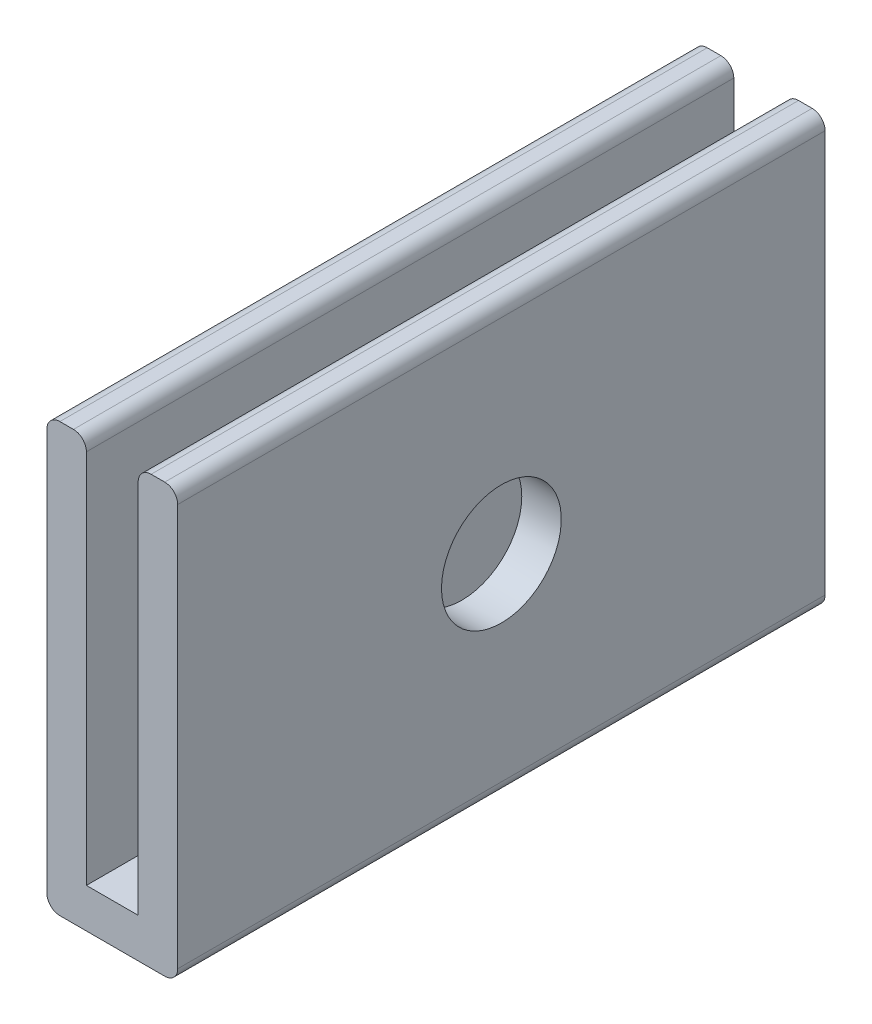
ISO-10303-21;
HEADER;
FILE_DESCRIPTION(('STEP AP214'),'2;1');
FILE_NAME('part.step','',(''),(''),'','','');
FILE_SCHEMA(('AUTOMOTIVE_DESIGN { 1 0 10303 214 1 1 1 1 }'));
ENDSEC;
DATA;
#1=APPLICATION_CONTEXT('core data for automotive mechanical design processes');
#2=APPLICATION_PROTOCOL_DEFINITION('international standard','automotive_design',2000,#1);
#3=PRODUCT_CONTEXT('',#1,'mechanical');
#4=PRODUCT('Part','Part','',(#3));
#5=PRODUCT_RELATED_PRODUCT_CATEGORY('part','',(#4));
#6=PRODUCT_DEFINITION_FORMATION('','',#4);
#7=PRODUCT_DEFINITION_CONTEXT('part definition',#1,'design');
#8=PRODUCT_DEFINITION('design','',#6,#7);
#9=PRODUCT_DEFINITION_SHAPE('','',#8);
#10=(LENGTH_UNIT() NAMED_UNIT(*) SI_UNIT(.MILLI.,.METRE.));
#11=(NAMED_UNIT(*) PLANE_ANGLE_UNIT() SI_UNIT($,.RADIAN.));
#12=(NAMED_UNIT(*) SI_UNIT($,.STERADIAN.) SOLID_ANGLE_UNIT());
#13=UNCERTAINTY_MEASURE_WITH_UNIT(LENGTH_MEASURE(1.E-05),#10,'distance_accuracy_value','');
#14=(GEOMETRIC_REPRESENTATION_CONTEXT(3) GLOBAL_UNCERTAINTY_ASSIGNED_CONTEXT((#13)) GLOBAL_UNIT_ASSIGNED_CONTEXT((#10,
#11,#12)) REPRESENTATION_CONTEXT('',''));
#15=CARTESIAN_POINT('',(0.,0.,0.));
#16=DIRECTION('',(0.,0.,1.));
#17=DIRECTION('',(1.,0.,0.));
#18=AXIS2_PLACEMENT_3D('',#15,#16,#17);
#19=CARTESIAN_POINT('',(3.64,12.82,20.));
#20=DIRECTION('',(0.,0.,-1.));
#21=DIRECTION('',(-1.,0.,0.));
#22=AXIS2_PLACEMENT_3D('',#19,#20,#21);
#23=CYLINDRICAL_SURFACE('',#22,0.400000000000001);
#24=CARTESIAN_POINT('',(3.64,12.82,0.));
#25=DIRECTION('',(0.,0.,1.));
#26=DIRECTION('',(-1.,0.,0.));
#27=AXIS2_PLACEMENT_3D('',#24,#25,#26);
#28=CIRCLE('',#27,0.400000000000001);
#29=CARTESIAN_POINT('',(4.04,12.82,0.));
#30=VERTEX_POINT('',#29);
#31=CARTESIAN_POINT('',(3.64,13.22,0.));
#32=VERTEX_POINT('',#31);
#33=EDGE_CURVE('E176',#30,#32,#28,.T.);
#34=ORIENTED_EDGE('',*,*,#33,.T.);
#35=DIRECTION('',(0.,0.,-1.));
#36=VECTOR('',#35,1.);
#37=CARTESIAN_POINT('',(3.64,13.22,20.));
#38=LINE('',#37,#36);
#39=CARTESIAN_POINT('',(3.64,13.22,20.));
#40=VERTEX_POINT('',#39);
#41=EDGE_CURVE('E11',#40,#32,#38,.T.);
#42=ORIENTED_EDGE('',*,*,#41,.F.);
#43=CARTESIAN_POINT('',(3.64,12.82,20.));
#44=DIRECTION('',(0.,0.,1.));
#45=DIRECTION('',(-1.,0.,0.));
#46=AXIS2_PLACEMENT_3D('',#43,#44,#45);
#47=CIRCLE('',#46,0.400000000000001);
#48=CARTESIAN_POINT('',(4.04,12.82,20.));
#49=VERTEX_POINT('',#48);
#50=EDGE_CURVE('E217',#49,#40,#47,.T.);
#51=ORIENTED_EDGE('',*,*,#50,.F.);
#52=DIRECTION('',(0.,0.,-1.));
#53=VECTOR('',#52,1.);
#54=CARTESIAN_POINT('',(4.04,12.82,20.));
#55=LINE('',#54,#53);
#56=EDGE_CURVE('E172',#49,#30,#55,.T.);
#57=ORIENTED_EDGE('',*,*,#56,.T.);
#58=EDGE_LOOP('',(#34,#42,#51,#57));
#59=FACE_BOUND('',#58,.T.);
#60=ADVANCED_FACE('F39',(#59),#23,.T.);
#61=CARTESIAN_POINT('',(3.22,13.22,20.));
#62=DIRECTION('',(0.,-1.,0.));
#63=DIRECTION('',(0.,0.,-1.));
#64=AXIS2_PLACEMENT_3D('',#61,#62,#63);
#65=PLANE('',#64);
#66=DIRECTION('',(-1.,0.,0.));
#67=VECTOR('',#66,1.);
#68=CARTESIAN_POINT('',(3.22,13.22,0.));
#69=LINE('',#68,#67);
#70=CARTESIAN_POINT('',(3.22,13.22,0.));
#71=VERTEX_POINT('',#70);
#72=EDGE_CURVE('E180',#32,#71,#69,.T.);
#73=ORIENTED_EDGE('',*,*,#72,.T.);
#74=DIRECTION('',(0.,0.,-1.));
#75=VECTOR('',#74,1.);
#76=CARTESIAN_POINT('',(3.22,13.22,20.));
#77=LINE('',#76,#75);
#78=CARTESIAN_POINT('',(3.22,13.22,20.));
#79=VERTEX_POINT('',#78);
#80=EDGE_CURVE('E48',#79,#71,#77,.T.);
#81=ORIENTED_EDGE('',*,*,#80,.F.);
#82=DIRECTION('',(-1.,0.,0.));
#83=VECTOR('',#82,1.);
#84=CARTESIAN_POINT('',(3.22,13.22,20.));
#85=LINE('',#84,#83);
#86=EDGE_CURVE('E117',#40,#79,#85,.T.);
#87=ORIENTED_EDGE('',*,*,#86,.F.);
#88=ORIENTED_EDGE('',*,*,#41,.T.);
#89=EDGE_LOOP('',(#73,#81,#87,#88));
#90=FACE_BOUND('',#89,.T.);
#91=ADVANCED_FACE('F327',(#90),#65,.F.);
#92=CARTESIAN_POINT('',(3.22,12.82,20.));
#93=DIRECTION('',(0.,0.,-1.));
#94=DIRECTION('',(-1.,0.,0.));
#95=AXIS2_PLACEMENT_3D('',#92,#93,#94);
#96=CYLINDRICAL_SURFACE('',#95,0.399999999999999);
#97=CARTESIAN_POINT('',(3.22,12.82,0.));
#98=DIRECTION('',(0.,0.,1.));
#99=DIRECTION('',(1.,0.,0.));
#100=AXIS2_PLACEMENT_3D('',#97,#98,#99);
#101=CIRCLE('',#100,0.399999999999999);
#102=CARTESIAN_POINT('',(2.82,12.82,0.));
#103=VERTEX_POINT('',#102);
#104=EDGE_CURVE('E184',#71,#103,#101,.T.);
#105=ORIENTED_EDGE('',*,*,#104,.T.);
#106=DIRECTION('',(0.,0.,-1.));
#107=VECTOR('',#106,1.);
#108=CARTESIAN_POINT('',(2.82,12.82,20.));
#109=LINE('',#108,#107);
#110=CARTESIAN_POINT('',(2.82,12.82,20.));
#111=VERTEX_POINT('',#110);
#112=EDGE_CURVE('E252',#111,#103,#109,.T.);
#113=ORIENTED_EDGE('',*,*,#112,.F.);
#114=CARTESIAN_POINT('',(3.22,12.82,20.));
#115=DIRECTION('',(0.,0.,1.));
#116=DIRECTION('',(1.,0.,0.));
#117=AXIS2_PLACEMENT_3D('',#114,#115,#116);
#118=CIRCLE('',#117,0.399999999999999);
#119=EDGE_CURVE('E262',#79,#111,#118,.T.);
#120=ORIENTED_EDGE('',*,*,#119,.F.);
#121=ORIENTED_EDGE('',*,*,#80,.T.);
#122=EDGE_LOOP('',(#105,#113,#120,#121));
#123=FACE_BOUND('',#122,.T.);
#124=ADVANCED_FACE('F260',(#123),#96,.T.);
#125=CARTESIAN_POINT('',(2.82,1.22,20.));
#126=DIRECTION('',(1.,0.,0.));
#127=DIRECTION('',(0.,0.,-1.));
#128=AXIS2_PLACEMENT_3D('',#125,#126,#127);
#129=PLANE('',#128);
#130=CARTESIAN_POINT('',(2.82,6.5,10.));
#131=DIRECTION('',(1.,0.,0.));
#132=DIRECTION('',(0.,0.,-1.));
#133=AXIS2_PLACEMENT_3D('',#130,#131,#132);
#134=CIRCLE('',#133,1.85);
#135=CARTESIAN_POINT('',(2.82,6.5,8.15));
#136=VERTEX_POINT('',#135);
#137=EDGE_CURVE('E181',#136,#136,#134,.T.);
#138=ORIENTED_EDGE('',*,*,#137,.T.);
#139=EDGE_LOOP('',(#138));
#140=FACE_BOUND('',#139,.T.);
#141=DIRECTION('',(0.,-1.,0.));
#142=VECTOR('',#141,1.);
#143=CARTESIAN_POINT('',(2.82,1.22,0.));
#144=LINE('',#143,#142);
#145=CARTESIAN_POINT('',(2.82,1.22,0.));
#146=VERTEX_POINT('',#145);
#147=EDGE_CURVE('E187',#103,#146,#144,.T.);
#148=ORIENTED_EDGE('',*,*,#147,.T.);
#149=DIRECTION('',(0.,0.,-1.));
#150=VECTOR('',#149,1.);
#151=CARTESIAN_POINT('',(2.82,1.22,20.));
#152=LINE('',#151,#150);
#153=CARTESIAN_POINT('',(2.82,1.22,20.));
#154=VERTEX_POINT('',#153);
#155=EDGE_CURVE('E248',#154,#146,#152,.T.);
#156=ORIENTED_EDGE('',*,*,#155,.F.);
#157=DIRECTION('',(0.,-1.,0.));
#158=VECTOR('',#157,1.);
#159=CARTESIAN_POINT('',(2.82,1.22,20.));
#160=LINE('',#159,#158);
#161=EDGE_CURVE('E281',#111,#154,#160,.T.);
#162=ORIENTED_EDGE('',*,*,#161,.F.);
#163=ORIENTED_EDGE('',*,*,#112,.T.);
#164=EDGE_LOOP('',(#148,#156,#162,#163));
#165=FACE_BOUND('',#164,.T.);
#166=ADVANCED_FACE('F271',(#140,#165),#129,.F.);
#167=CARTESIAN_POINT('',(1.22,1.22,20.));
#168=DIRECTION('',(0.,-1.,0.));
#169=DIRECTION('',(0.,0.,-1.));
#170=AXIS2_PLACEMENT_3D('',#167,#168,#169);
#171=PLANE('',#170);
#172=DIRECTION('',(-1.,0.,0.));
#173=VECTOR('',#172,1.);
#174=CARTESIAN_POINT('',(1.22,1.22,0.));
#175=LINE('',#174,#173);
#176=CARTESIAN_POINT('',(1.22,1.22,0.));
#177=VERTEX_POINT('',#176);
#178=EDGE_CURVE('E190',#146,#177,#175,.T.);
#179=ORIENTED_EDGE('',*,*,#178,.T.);
#180=DIRECTION('',(0.,0.,-1.));
#181=VECTOR('',#180,1.);
#182=CARTESIAN_POINT('',(1.22,1.22,20.));
#183=LINE('',#182,#181);
#184=CARTESIAN_POINT('',(1.22,1.22,20.));
#185=VERTEX_POINT('',#184);
#186=EDGE_CURVE('E244',#185,#177,#183,.T.);
#187=ORIENTED_EDGE('',*,*,#186,.F.);
#188=DIRECTION('',(-1.,0.,0.));
#189=VECTOR('',#188,1.);
#190=CARTESIAN_POINT('',(1.22,1.22,20.));
#191=LINE('',#190,#189);
#192=EDGE_CURVE('E277',#154,#185,#191,.T.);
#193=ORIENTED_EDGE('',*,*,#192,.F.);
#194=ORIENTED_EDGE('',*,*,#155,.T.);
#195=EDGE_LOOP('',(#179,#187,#193,#194));
#196=FACE_BOUND('',#195,.T.);
#197=ADVANCED_FACE('F275',(#196),#171,.F.);
#198=CARTESIAN_POINT('',(1.22,1.22,20.));
#199=DIRECTION('',(-1.,0.,0.));
#200=DIRECTION('',(0.,0.,1.));
#201=AXIS2_PLACEMENT_3D('',#198,#199,#200);
#202=PLANE('',#201);
#203=CARTESIAN_POINT('',(1.22,6.5,10.));
#204=DIRECTION('',(-1.,0.,0.));
#205=DIRECTION('',(0.,0.,1.));
#206=AXIS2_PLACEMENT_3D('',#203,#204,#205);
#207=CIRCLE('',#206,1.85);
#208=CARTESIAN_POINT('',(1.22,6.5,11.85));
#209=VERTEX_POINT('',#208);
#210=EDGE_CURVE('E440',#209,#209,#207,.T.);
#211=ORIENTED_EDGE('',*,*,#210,.T.);
#212=EDGE_LOOP('',(#211));
#213=FACE_BOUND('',#212,.T.);
#214=DIRECTION('',(0.,1.,0.));
#215=VECTOR('',#214,1.);
#216=CARTESIAN_POINT('',(1.22,1.22,0.));
#217=LINE('',#216,#215);
#218=CARTESIAN_POINT('',(1.22,12.82,0.));
#219=VERTEX_POINT('',#218);
#220=EDGE_CURVE('E193',#177,#219,#217,.T.);
#221=ORIENTED_EDGE('',*,*,#220,.T.);
#222=DIRECTION('',(0.,0.,-1.));
#223=VECTOR('',#222,1.);
#224=CARTESIAN_POINT('',(1.22,12.82,20.));
#225=LINE('',#224,#223);
#226=CARTESIAN_POINT('',(1.22,12.82,20.));
#227=VERTEX_POINT('',#226);
#228=EDGE_CURVE('E240',#227,#219,#225,.T.);
#229=ORIENTED_EDGE('',*,*,#228,.F.);
#230=DIRECTION('',(0.,1.,0.));
#231=VECTOR('',#230,1.);
#232=CARTESIAN_POINT('',(1.22,1.22,20.));
#233=LINE('',#232,#231);
#234=EDGE_CURVE('E280',#185,#227,#233,.T.);
#235=ORIENTED_EDGE('',*,*,#234,.F.);
#236=ORIENTED_EDGE('',*,*,#186,.T.);
#237=EDGE_LOOP('',(#221,#229,#235,#236));
#238=FACE_BOUND('',#237,.T.);
#239=ADVANCED_FACE('F341',(#213,#238),#202,.F.);
#240=CARTESIAN_POINT('',(0.819999999999998,12.82,20.));
#241=DIRECTION('',(0.,0.,-1.));
#242=DIRECTION('',(-1.,0.,0.));
#243=AXIS2_PLACEMENT_3D('',#240,#241,#242);
#244=CYLINDRICAL_SURFACE('',#243,0.400000000000001);
#245=CARTESIAN_POINT('',(0.819999999999998,12.82,0.));
#246=DIRECTION('',(0.,0.,1.));
#247=DIRECTION('',(1.,0.,0.));
#248=AXIS2_PLACEMENT_3D('',#245,#246,#247);
#249=CIRCLE('',#248,0.400000000000001);
#250=CARTESIAN_POINT('',(0.819999999999998,13.22,0.));
#251=VERTEX_POINT('',#250);
#252=EDGE_CURVE('E196',#219,#251,#249,.T.);
#253=ORIENTED_EDGE('',*,*,#252,.T.);
#254=DIRECTION('',(0.,0.,-1.));
#255=VECTOR('',#254,1.);
#256=CARTESIAN_POINT('',(0.819999999999998,13.22,20.));
#257=LINE('',#256,#255);
#258=CARTESIAN_POINT('',(0.819999999999998,13.22,20.));
#259=VERTEX_POINT('',#258);
#260=EDGE_CURVE('E236',#259,#251,#257,.T.);
#261=ORIENTED_EDGE('',*,*,#260,.F.);
#262=CARTESIAN_POINT('',(0.819999999999998,12.82,20.));
#263=DIRECTION('',(0.,0.,1.));
#264=DIRECTION('',(1.,0.,0.));
#265=AXIS2_PLACEMENT_3D('',#262,#263,#264);
#266=CIRCLE('',#265,0.400000000000001);
#267=EDGE_CURVE('E285',#227,#259,#266,.T.);
#268=ORIENTED_EDGE('',*,*,#267,.F.);
#269=ORIENTED_EDGE('',*,*,#228,.T.);
#270=EDGE_LOOP('',(#253,#261,#268,#269));
#271=FACE_BOUND('',#270,.T.);
#272=ADVANCED_FACE('F344',(#271),#244,.T.);
#273=CARTESIAN_POINT('',(0.399999999999998,13.22,20.));
#274=DIRECTION('',(0.,-1.,0.));
#275=DIRECTION('',(0.,0.,-1.));
#276=AXIS2_PLACEMENT_3D('',#273,#274,#275);
#277=PLANE('',#276);
#278=DIRECTION('',(-1.,0.,0.));
#279=VECTOR('',#278,1.);
#280=CARTESIAN_POINT('',(0.399999999999998,13.22,0.));
#281=LINE('',#280,#279);
#282=CARTESIAN_POINT('',(0.399999999999998,13.22,0.));
#283=VERTEX_POINT('',#282);
#284=EDGE_CURVE('E199',#251,#283,#281,.T.);
#285=ORIENTED_EDGE('',*,*,#284,.T.);
#286=DIRECTION('',(0.,0.,-1.));
#287=VECTOR('',#286,1.);
#288=CARTESIAN_POINT('',(0.399999999999998,13.22,20.));
#289=LINE('',#288,#287);
#290=CARTESIAN_POINT('',(0.399999999999998,13.22,20.));
#291=VERTEX_POINT('',#290);
#292=EDGE_CURVE('E232',#291,#283,#289,.T.);
#293=ORIENTED_EDGE('',*,*,#292,.F.);
#294=DIRECTION('',(-1.,0.,0.));
#295=VECTOR('',#294,1.);
#296=CARTESIAN_POINT('',(0.399999999999998,13.22,20.));
#297=LINE('',#296,#295);
#298=EDGE_CURVE('E292',#259,#291,#297,.T.);
#299=ORIENTED_EDGE('',*,*,#298,.F.);
#300=ORIENTED_EDGE('',*,*,#260,.T.);
#301=EDGE_LOOP('',(#285,#293,#299,#300));
#302=FACE_BOUND('',#301,.T.);
#303=ADVANCED_FACE('F348',(#302),#277,.F.);
#304=CARTESIAN_POINT('',(0.399999999999998,12.82,20.));
#305=DIRECTION('',(0.,0.,-1.));
#306=DIRECTION('',(-1.,0.,0.));
#307=AXIS2_PLACEMENT_3D('',#304,#305,#306);
#308=CYLINDRICAL_SURFACE('',#307,0.399999999999999);
#309=CARTESIAN_POINT('',(0.399999999999998,12.82,0.));
#310=DIRECTION('',(0.,0.,1.));
#311=DIRECTION('',(-1.,0.,0.));
#312=AXIS2_PLACEMENT_3D('',#309,#310,#311);
#313=CIRCLE('',#312,0.399999999999999);
#314=CARTESIAN_POINT('',(0.,12.82,0.));
#315=VERTEX_POINT('',#314);
#316=EDGE_CURVE('E202',#283,#315,#313,.T.);
#317=ORIENTED_EDGE('',*,*,#316,.T.);
#318=DIRECTION('',(0.,0.,-1.));
#319=VECTOR('',#318,1.);
#320=CARTESIAN_POINT('',(0.,12.82,20.));
#321=LINE('',#320,#319);
#322=CARTESIAN_POINT('',(0.,12.82,20.));
#323=VERTEX_POINT('',#322);
#324=EDGE_CURVE('E228',#323,#315,#321,.T.);
#325=ORIENTED_EDGE('',*,*,#324,.F.);
#326=CARTESIAN_POINT('',(0.399999999999998,12.82,20.));
#327=DIRECTION('',(0.,0.,1.));
#328=DIRECTION('',(-1.,0.,0.));
#329=AXIS2_PLACEMENT_3D('',#326,#327,#328);
#330=CIRCLE('',#329,0.399999999999999);
#331=EDGE_CURVE('E295',#291,#323,#330,.T.);
#332=ORIENTED_EDGE('',*,*,#331,.F.);
#333=ORIENTED_EDGE('',*,*,#292,.T.);
#334=EDGE_LOOP('',(#317,#325,#332,#333));
#335=FACE_BOUND('',#334,.T.);
#336=ADVANCED_FACE('F352',(#335),#308,.T.);
#337=CARTESIAN_POINT('',(0.,0.400000000000003,20.));
#338=DIRECTION('',(1.,0.,0.));
#339=DIRECTION('',(0.,0.,-1.));
#340=AXIS2_PLACEMENT_3D('',#337,#338,#339);
#341=PLANE('',#340);
#342=CARTESIAN_POINT('',(0.,6.5,10.));
#343=DIRECTION('',(-1.,0.,0.));
#344=DIRECTION('',(0.,0.,1.));
#345=AXIS2_PLACEMENT_3D('',#342,#343,#344);
#346=CIRCLE('',#345,1.85);
#347=CARTESIAN_POINT('',(0.,6.5,11.85));
#348=VERTEX_POINT('',#347);
#349=EDGE_CURVE('E437',#348,#348,#346,.T.);
#350=ORIENTED_EDGE('',*,*,#349,.F.);
#351=EDGE_LOOP('',(#350));
#352=FACE_BOUND('',#351,.T.);
#353=DIRECTION('',(0.,-1.,0.));
#354=VECTOR('',#353,1.);
#355=CARTESIAN_POINT('',(0.,0.400000000000003,0.));
#356=LINE('',#355,#354);
#357=CARTESIAN_POINT('',(0.,0.400000000000003,0.));
#358=VERTEX_POINT('',#357);
#359=EDGE_CURVE('E205',#315,#358,#356,.T.);
#360=ORIENTED_EDGE('',*,*,#359,.T.);
#361=DIRECTION('',(0.,0.,-1.));
#362=VECTOR('',#361,1.);
#363=CARTESIAN_POINT('',(0.,0.400000000000003,20.));
#364=LINE('',#363,#362);
#365=CARTESIAN_POINT('',(0.,0.400000000000003,20.));
#366=VERTEX_POINT('',#365);
#367=EDGE_CURVE('E224',#366,#358,#364,.T.);
#368=ORIENTED_EDGE('',*,*,#367,.F.);
#369=DIRECTION('',(0.,-1.,0.));
#370=VECTOR('',#369,1.);
#371=CARTESIAN_POINT('',(0.,0.400000000000003,20.));
#372=LINE('',#371,#370);
#373=EDGE_CURVE('E298',#323,#366,#372,.T.);
#374=ORIENTED_EDGE('',*,*,#373,.F.);
#375=ORIENTED_EDGE('',*,*,#324,.T.);
#376=EDGE_LOOP('',(#360,#368,#374,#375));
#377=FACE_BOUND('',#376,.T.);
#378=ADVANCED_FACE('F306',(#352,#377),#341,.F.);
#379=CARTESIAN_POINT('',(0.4,0.4,20.));
#380=DIRECTION('',(0.,0.,-1.));
#381=DIRECTION('',(-1.,0.,0.));
#382=AXIS2_PLACEMENT_3D('',#379,#380,#381);
#383=CYLINDRICAL_SURFACE('',#382,0.4);
#384=CARTESIAN_POINT('',(0.4,0.4,0.));
#385=DIRECTION('',(0.,0.,1.));
#386=DIRECTION('',(-1.,0.,0.));
#387=AXIS2_PLACEMENT_3D('',#384,#385,#386);
#388=CIRCLE('',#387,0.4);
#389=CARTESIAN_POINT('',(0.4,0.,0.));
#390=VERTEX_POINT('',#389);
#391=EDGE_CURVE('E208',#358,#390,#388,.T.);
#392=ORIENTED_EDGE('',*,*,#391,.T.);
#393=DIRECTION('',(0.,0.,-1.));
#394=VECTOR('',#393,1.);
#395=CARTESIAN_POINT('',(0.4,0.,20.));
#396=LINE('',#395,#394);
#397=CARTESIAN_POINT('',(0.4,0.,20.));
#398=VERTEX_POINT('',#397);
#399=EDGE_CURVE('E165',#398,#390,#396,.T.);
#400=ORIENTED_EDGE('',*,*,#399,.F.);
#401=CARTESIAN_POINT('',(0.4,0.4,20.));
#402=DIRECTION('',(0.,0.,1.));
#403=DIRECTION('',(-1.,0.,0.));
#404=AXIS2_PLACEMENT_3D('',#401,#402,#403);
#405=CIRCLE('',#404,0.4);
#406=EDGE_CURVE('E154',#366,#398,#405,.T.);
#407=ORIENTED_EDGE('',*,*,#406,.F.);
#408=ORIENTED_EDGE('',*,*,#367,.T.);
#409=EDGE_LOOP('',(#392,#400,#407,#408));
#410=FACE_BOUND('',#409,.T.);
#411=ADVANCED_FACE('F310',(#410),#383,.T.);
#412=CARTESIAN_POINT('',(0.4,0.,20.));
#413=DIRECTION('',(0.,1.,0.));
#414=DIRECTION('',(0.,0.,1.));
#415=AXIS2_PLACEMENT_3D('',#412,#413,#414);
#416=PLANE('',#415);
#417=DIRECTION('',(1.,0.,0.));
#418=VECTOR('',#417,1.);
#419=CARTESIAN_POINT('',(0.4,0.,0.));
#420=LINE('',#419,#418);
#421=CARTESIAN_POINT('',(3.64,0.,0.));
#422=VERTEX_POINT('',#421);
#423=EDGE_CURVE('E163',#390,#422,#420,.T.);
#424=ORIENTED_EDGE('',*,*,#423,.T.);
#425=DIRECTION('',(0.,0.,-1.));
#426=VECTOR('',#425,1.);
#427=CARTESIAN_POINT('',(3.64,0.,20.));
#428=LINE('',#427,#426);
#429=CARTESIAN_POINT('',(3.64,0.,20.));
#430=VERTEX_POINT('',#429);
#431=EDGE_CURVE('E160',#430,#422,#428,.T.);
#432=ORIENTED_EDGE('',*,*,#431,.F.);
#433=DIRECTION('',(1.,0.,0.));
#434=VECTOR('',#433,1.);
#435=CARTESIAN_POINT('',(0.4,0.,20.));
#436=LINE('',#435,#434);
#437=EDGE_CURVE('E148',#398,#430,#436,.T.);
#438=ORIENTED_EDGE('',*,*,#437,.F.);
#439=ORIENTED_EDGE('',*,*,#399,.T.);
#440=EDGE_LOOP('',(#424,#432,#438,#439));
#441=FACE_BOUND('',#440,.T.);
#442=ADVANCED_FACE('F161',(#441),#416,.F.);
#443=CARTESIAN_POINT('',(3.64,0.4,20.));
#444=DIRECTION('',(0.,0.,-1.));
#445=DIRECTION('',(-1.,0.,0.));
#446=AXIS2_PLACEMENT_3D('',#443,#444,#445);
#447=CYLINDRICAL_SURFACE('',#446,0.4);
#448=CARTESIAN_POINT('',(3.64,0.4,0.));
#449=DIRECTION('',(0.,0.,1.));
#450=DIRECTION('',(1.,0.,0.));
#451=AXIS2_PLACEMENT_3D('',#448,#449,#450);
#452=CIRCLE('',#451,0.4);
#453=CARTESIAN_POINT('',(4.04,0.4,0.));
#454=VERTEX_POINT('',#453);
#455=EDGE_CURVE('E103',#422,#454,#452,.T.);
#456=ORIENTED_EDGE('',*,*,#455,.T.);
#457=DIRECTION('',(0.,0.,-1.));
#458=VECTOR('',#457,1.);
#459=CARTESIAN_POINT('',(4.04,0.4,20.));
#460=LINE('',#459,#458);
#461=CARTESIAN_POINT('',(4.04,0.4,20.));
#462=VERTEX_POINT('',#461);
#463=EDGE_CURVE('E166',#462,#454,#460,.T.);
#464=ORIENTED_EDGE('',*,*,#463,.F.);
#465=CARTESIAN_POINT('',(3.64,0.4,20.));
#466=DIRECTION('',(0.,0.,1.));
#467=DIRECTION('',(1.,0.,0.));
#468=AXIS2_PLACEMENT_3D('',#465,#466,#467);
#469=CIRCLE('',#468,0.4);
#470=EDGE_CURVE('E152',#430,#462,#469,.T.);
#471=ORIENTED_EDGE('',*,*,#470,.F.);
#472=ORIENTED_EDGE('',*,*,#431,.T.);
#473=EDGE_LOOP('',(#456,#464,#471,#472));
#474=FACE_BOUND('',#473,.T.);
#475=ADVANCED_FACE('F168',(#474),#447,.T.);
#476=CARTESIAN_POINT('',(4.04,0.4,20.));
#477=DIRECTION('',(-1.,0.,0.));
#478=DIRECTION('',(0.,0.,1.));
#479=AXIS2_PLACEMENT_3D('',#476,#477,#478);
#480=PLANE('',#479);
#481=CARTESIAN_POINT('',(4.04,6.5,10.));
#482=DIRECTION('',(-1.,0.,0.));
#483=DIRECTION('',(0.,0.,1.));
#484=AXIS2_PLACEMENT_3D('',#481,#482,#483);
#485=CIRCLE('',#484,1.85);
#486=CARTESIAN_POINT('',(4.04,6.5,11.85));
#487=VERTEX_POINT('',#486);
#488=EDGE_CURVE('E442',#487,#487,#485,.F.);
#489=ORIENTED_EDGE('',*,*,#488,.F.);
#490=EDGE_LOOP('',(#489));
#491=FACE_BOUND('',#490,.T.);
#492=DIRECTION('',(0.,1.,0.));
#493=VECTOR('',#492,1.);
#494=CARTESIAN_POINT('',(4.04,0.4,0.));
#495=LINE('',#494,#493);
#496=EDGE_CURVE('E109',#454,#30,#495,.T.);
#497=ORIENTED_EDGE('',*,*,#496,.T.);
#498=ORIENTED_EDGE('',*,*,#56,.F.);
#499=DIRECTION('',(0.,1.,0.));
#500=VECTOR('',#499,1.);
#501=CARTESIAN_POINT('',(4.04,0.4,20.));
#502=LINE('',#501,#500);
#503=EDGE_CURVE('E56',#462,#49,#502,.T.);
#504=ORIENTED_EDGE('',*,*,#503,.F.);
#505=ORIENTED_EDGE('',*,*,#463,.T.);
#506=EDGE_LOOP('',(#497,#498,#504,#505));
#507=FACE_BOUND('',#506,.T.);
#508=ADVANCED_FACE('F314',(#491,#507),#480,.F.);
#509=CARTESIAN_POINT('',(3.64,12.82,20.));
#510=DIRECTION('',(0.,0.,-1.));
#511=DIRECTION('',(-1.,0.,0.));
#512=AXIS2_PLACEMENT_3D('',#509,#510,#511);
#513=PLANE('',#512);
#514=ORIENTED_EDGE('',*,*,#50,.T.);
#515=ORIENTED_EDGE('',*,*,#86,.T.);
#516=ORIENTED_EDGE('',*,*,#119,.T.);
#517=ORIENTED_EDGE('',*,*,#161,.T.);
#518=ORIENTED_EDGE('',*,*,#192,.T.);
#519=ORIENTED_EDGE('',*,*,#234,.T.);
#520=ORIENTED_EDGE('',*,*,#267,.T.);
#521=ORIENTED_EDGE('',*,*,#298,.T.);
#522=ORIENTED_EDGE('',*,*,#331,.T.);
#523=ORIENTED_EDGE('',*,*,#373,.T.);
#524=ORIENTED_EDGE('',*,*,#406,.T.);
#525=ORIENTED_EDGE('',*,*,#437,.T.);
#526=ORIENTED_EDGE('',*,*,#470,.T.);
#527=ORIENTED_EDGE('',*,*,#503,.T.);
#528=EDGE_LOOP('',(#514,#515,#516,#517,#518,#519,#520,#521,#522,#523,#524,#525,#526,#527));
#529=FACE_BOUND('',#528,.T.);
#530=ADVANCED_FACE('F150',(#529),#513,.F.);
#531=CARTESIAN_POINT('',(3.64,12.82,0.));
#532=DIRECTION('',(0.,0.,-1.));
#533=DIRECTION('',(-1.,0.,0.));
#534=AXIS2_PLACEMENT_3D('',#531,#532,#533);
#535=PLANE('',#534);
#536=ORIENTED_EDGE('',*,*,#33,.F.);
#537=ORIENTED_EDGE('',*,*,#496,.F.);
#538=ORIENTED_EDGE('',*,*,#455,.F.);
#539=ORIENTED_EDGE('',*,*,#423,.F.);
#540=ORIENTED_EDGE('',*,*,#391,.F.);
#541=ORIENTED_EDGE('',*,*,#359,.F.);
#542=ORIENTED_EDGE('',*,*,#316,.F.);
#543=ORIENTED_EDGE('',*,*,#284,.F.);
#544=ORIENTED_EDGE('',*,*,#252,.F.);
#545=ORIENTED_EDGE('',*,*,#220,.F.);
#546=ORIENTED_EDGE('',*,*,#178,.F.);
#547=ORIENTED_EDGE('',*,*,#147,.F.);
#548=ORIENTED_EDGE('',*,*,#104,.F.);
#549=ORIENTED_EDGE('',*,*,#72,.F.);
#550=EDGE_LOOP('',(#536,#537,#538,#539,#540,#541,#542,#543,#544,#545,#546,#547,#548,#549));
#551=FACE_BOUND('',#550,.T.);
#552=ADVANCED_FACE('F266',(#551),#535,.T.);
#553=CARTESIAN_POINT('',(9.27259018078045,6.5,10.));
#554=DIRECTION('',(-1.,0.,0.));
#555=DIRECTION('',(0.,0.,1.));
#556=AXIS2_PLACEMENT_3D('',#553,#554,#555);
#557=CYLINDRICAL_SURFACE('',#556,1.85);
#558=ORIENTED_EDGE('',*,*,#488,.T.);
#559=EDGE_LOOP('',(#558));
#560=FACE_BOUND('',#559,.T.);
#561=ORIENTED_EDGE('',*,*,#137,.F.);
#562=EDGE_LOOP('',(#561));
#563=FACE_BOUND('',#562,.T.);
#564=ADVANCED_FACE('F387',(#560,#563),#557,.F.);
#565=ORIENTED_EDGE('',*,*,#349,.T.);
#566=EDGE_LOOP('',(#565));
#567=FACE_BOUND('',#566,.T.);
#568=ORIENTED_EDGE('',*,*,#210,.F.);
#569=EDGE_LOOP('',(#568));
#570=FACE_BOUND('',#569,.T.);
#571=ADVANCED_FACE('F421',(#567,#570),#557,.F.);
#572=CLOSED_SHELL('',(#60,#91,#124,#166,#197,#239,#272,#303,#336,#378,#411,#442,#475,#508,#530,
#552,#564,#571));
#573=MANIFOLD_SOLID_BREP('B2',#572);
#574=ADVANCED_BREP_SHAPE_REPRESENTATION('',(#18,#573),#14);
#575=SHAPE_DEFINITION_REPRESENTATION(#9,#574);
ENDSEC;
END-ISO-10303-21;
